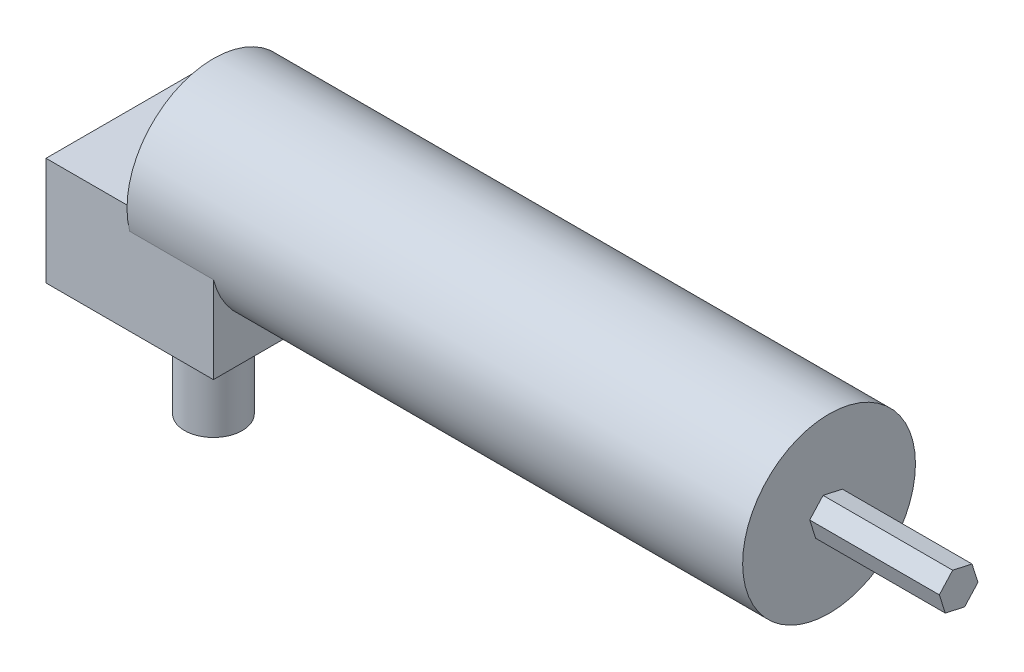
ISO-10303-21;
HEADER;
FILE_DESCRIPTION(('STEP AP214'),'2;1');
FILE_NAME('part.step','',(''),(''),'','','');
FILE_SCHEMA(('AUTOMOTIVE_DESIGN { 1 0 10303 214 1 1 1 1 }'));
ENDSEC;
DATA;
#1=APPLICATION_CONTEXT('core data for automotive mechanical design processes');
#2=APPLICATION_PROTOCOL_DEFINITION('international standard','automotive_design',2000,#1);
#3=PRODUCT_CONTEXT('',#1,'mechanical');
#4=PRODUCT('Part','Part','',(#3));
#5=PRODUCT_RELATED_PRODUCT_CATEGORY('part','',(#4));
#6=PRODUCT_DEFINITION_FORMATION('','',#4);
#7=PRODUCT_DEFINITION_CONTEXT('part definition',#1,'design');
#8=PRODUCT_DEFINITION('design','',#6,#7);
#9=PRODUCT_DEFINITION_SHAPE('','',#8);
#10=(LENGTH_UNIT() NAMED_UNIT(*) SI_UNIT(.MILLI.,.METRE.));
#11=(NAMED_UNIT(*) PLANE_ANGLE_UNIT() SI_UNIT($,.RADIAN.));
#12=(NAMED_UNIT(*) SI_UNIT($,.STERADIAN.) SOLID_ANGLE_UNIT());
#13=UNCERTAINTY_MEASURE_WITH_UNIT(LENGTH_MEASURE(1.E-05),#10,'distance_accuracy_value','');
#14=(GEOMETRIC_REPRESENTATION_CONTEXT(3) GLOBAL_UNCERTAINTY_ASSIGNED_CONTEXT((#13)) GLOBAL_UNIT_ASSIGNED_CONTEXT((#10,
#11,#12)) REPRESENTATION_CONTEXT('',''));
#15=CARTESIAN_POINT('',(0.,0.,0.));
#16=DIRECTION('',(0.,0.,1.));
#17=DIRECTION('',(1.,0.,0.));
#18=AXIS2_PLACEMENT_3D('',#15,#16,#17);
#19=CARTESIAN_POINT('',(-15.5,20.,-15.5));
#20=DIRECTION('',(0.,0.,1.));
#21=DIRECTION('',(1.,0.,0.));
#22=AXIS2_PLACEMENT_3D('',#19,#20,#21);
#23=PLANE('',#22);
#24=DIRECTION('',(-1.,0.,0.));
#25=VECTOR('',#24,1.);
#26=CARTESIAN_POINT('',(114.,16.0313730334032,-15.5));
#27=LINE('',#26,#25);
#28=CARTESIAN_POINT('',(15.5,16.0313730334032,-15.5));
#29=VERTEX_POINT('',#28);
#30=CARTESIAN_POINT('',(0.,16.0313730334032,-15.5));
#31=VERTEX_POINT('',#30);
#32=EDGE_CURVE('E281',#29,#31,#27,.T.);
#33=ORIENTED_EDGE('',*,*,#32,.F.);
#34=DIRECTION('',(0.,-1.,0.));
#35=VECTOR('',#34,1.);
#36=CARTESIAN_POINT('',(15.5,20.,-15.5));
#37=LINE('',#36,#35);
#38=CARTESIAN_POINT('',(15.5,0.,-15.5));
#39=VERTEX_POINT('',#38);
#40=EDGE_CURVE('E308',#29,#39,#37,.T.);
#41=ORIENTED_EDGE('',*,*,#40,.T.);
#42=DIRECTION('',(-1.,0.,0.));
#43=VECTOR('',#42,1.);
#44=CARTESIAN_POINT('',(-15.5,0.,-15.5));
#45=LINE('',#44,#43);
#46=CARTESIAN_POINT('',(-15.5,0.,-15.5));
#47=VERTEX_POINT('',#46);
#48=EDGE_CURVE('E295',#39,#47,#45,.T.);
#49=ORIENTED_EDGE('',*,*,#48,.T.);
#50=DIRECTION('',(0.,-1.,0.));
#51=VECTOR('',#50,1.);
#52=CARTESIAN_POINT('',(-15.5,20.,-15.5));
#53=LINE('',#52,#51);
#54=CARTESIAN_POINT('',(-15.5,20.,-15.5));
#55=VERTEX_POINT('',#54);
#56=EDGE_CURVE('E305',#55,#47,#53,.T.);
#57=ORIENTED_EDGE('',*,*,#56,.F.);
#58=DIRECTION('',(-1.,0.,0.));
#59=VECTOR('',#58,1.);
#60=CARTESIAN_POINT('',(-15.5,20.,-15.5));
#61=LINE('',#60,#59);
#62=CARTESIAN_POINT('',(0.,20.,-15.5));
#63=VERTEX_POINT('',#62);
#64=EDGE_CURVE('E285',#63,#55,#61,.T.);
#65=ORIENTED_EDGE('',*,*,#64,.F.);
#66=DIRECTION('',(0.,1.,0.));
#67=VECTOR('',#66,1.);
#68=CARTESIAN_POINT('',(0.,20.,-15.5));
#69=LINE('',#68,#67);
#70=EDGE_CURVE('E275',#31,#63,#69,.T.);
#71=ORIENTED_EDGE('',*,*,#70,.F.);
#72=EDGE_LOOP('',(#33,#41,#49,#57,#65,#71));
#73=FACE_BOUND('',#72,.T.);
#74=ADVANCED_FACE('F37',(#73),#23,.F.);
#75=CARTESIAN_POINT('',(-15.5,20.,15.5));
#76=DIRECTION('',(0.,0.,-1.));
#77=DIRECTION('',(-1.,0.,0.));
#78=AXIS2_PLACEMENT_3D('',#75,#76,#77);
#79=PLANE('',#78);
#80=DIRECTION('',(-1.,0.,0.));
#81=VECTOR('',#80,1.);
#82=CARTESIAN_POINT('',(114.,16.0313730334032,15.5));
#83=LINE('',#82,#81);
#84=CARTESIAN_POINT('',(0.,16.0313730334032,15.5));
#85=VERTEX_POINT('',#84);
#86=CARTESIAN_POINT('',(15.5,16.0313730334032,15.5));
#87=VERTEX_POINT('',#86);
#88=EDGE_CURVE('E41',#85,#87,#83,.F.);
#89=ORIENTED_EDGE('',*,*,#88,.F.);
#90=DIRECTION('',(0.,-1.,0.));
#91=VECTOR('',#90,1.);
#92=CARTESIAN_POINT('',(0.,20.,15.5));
#93=LINE('',#92,#91);
#94=CARTESIAN_POINT('',(0.,20.,15.5));
#95=VERTEX_POINT('',#94);
#96=EDGE_CURVE('E270',#95,#85,#93,.T.);
#97=ORIENTED_EDGE('',*,*,#96,.F.);
#98=DIRECTION('',(1.,0.,0.));
#99=VECTOR('',#98,1.);
#100=CARTESIAN_POINT('',(-15.5,20.,15.5));
#101=LINE('',#100,#99);
#102=CARTESIAN_POINT('',(-15.5,20.,15.5));
#103=VERTEX_POINT('',#102);
#104=EDGE_CURVE('E290',#103,#95,#101,.T.);
#105=ORIENTED_EDGE('',*,*,#104,.F.);
#106=DIRECTION('',(0.,-1.,0.));
#107=VECTOR('',#106,1.);
#108=CARTESIAN_POINT('',(-15.5,20.,15.5));
#109=LINE('',#108,#107);
#110=CARTESIAN_POINT('',(-15.5,0.,15.5));
#111=VERTEX_POINT('',#110);
#112=EDGE_CURVE('E302',#103,#111,#109,.T.);
#113=ORIENTED_EDGE('',*,*,#112,.T.);
#114=DIRECTION('',(1.,0.,0.));
#115=VECTOR('',#114,1.);
#116=CARTESIAN_POINT('',(-15.5,0.,15.5));
#117=LINE('',#116,#115);
#118=CARTESIAN_POINT('',(15.5,0.,15.5));
#119=VERTEX_POINT('',#118);
#120=EDGE_CURVE('E288',#111,#119,#117,.T.);
#121=ORIENTED_EDGE('',*,*,#120,.T.);
#122=DIRECTION('',(0.,-1.,0.));
#123=VECTOR('',#122,1.);
#124=CARTESIAN_POINT('',(15.5,20.,15.5));
#125=LINE('',#124,#123);
#126=EDGE_CURVE('E292',#87,#119,#125,.T.);
#127=ORIENTED_EDGE('',*,*,#126,.F.);
#128=EDGE_LOOP('',(#89,#97,#105,#113,#121,#127));
#129=FACE_BOUND('',#128,.T.);
#130=ADVANCED_FACE('F319',(#129),#79,.F.);
#131=CARTESIAN_POINT('',(0.,20.,0.));
#132=DIRECTION('',(0.,-1.,0.));
#133=DIRECTION('',(0.,0.,-1.));
#134=AXIS2_PLACEMENT_3D('',#131,#132,#133);
#135=PLANE('',#134);
#136=DIRECTION('',(0.,0.,1.));
#137=VECTOR('',#136,1.);
#138=CARTESIAN_POINT('',(0.,20.,0.));
#139=LINE('',#138,#137);
#140=EDGE_CURVE('E309',#63,#95,#139,.T.);
#141=ORIENTED_EDGE('',*,*,#140,.F.);
#142=ORIENTED_EDGE('',*,*,#64,.T.);
#143=DIRECTION('',(0.,0.,1.));
#144=VECTOR('',#143,1.);
#145=CARTESIAN_POINT('',(-15.5,20.,15.5));
#146=LINE('',#145,#144);
#147=EDGE_CURVE('E287',#55,#103,#146,.T.);
#148=ORIENTED_EDGE('',*,*,#147,.T.);
#149=ORIENTED_EDGE('',*,*,#104,.T.);
#150=EDGE_LOOP('',(#141,#142,#148,#149));
#151=FACE_BOUND('',#150,.T.);
#152=ADVANCED_FACE('F328',(#151),#135,.F.);
#153=CARTESIAN_POINT('',(15.5,20.,15.5));
#154=DIRECTION('',(-1.,0.,0.));
#155=DIRECTION('',(0.,0.,1.));
#156=AXIS2_PLACEMENT_3D('',#153,#154,#155);
#157=PLANE('',#156);
#158=CARTESIAN_POINT('',(15.5,20.,0.));
#159=DIRECTION('',(-1.,0.,0.));
#160=DIRECTION('',(0.,0.,1.));
#161=AXIS2_PLACEMENT_3D('',#158,#159,#160);
#162=CIRCLE('',#161,16.);
#163=EDGE_CURVE('E278',#87,#29,#162,.F.);
#164=ORIENTED_EDGE('',*,*,#163,.F.);
#165=ORIENTED_EDGE('',*,*,#126,.T.);
#166=DIRECTION('',(0.,0.,-1.));
#167=VECTOR('',#166,1.);
#168=CARTESIAN_POINT('',(15.5,0.,15.5));
#169=LINE('',#168,#167);
#170=EDGE_CURVE('E284',#119,#39,#169,.T.);
#171=ORIENTED_EDGE('',*,*,#170,.T.);
#172=ORIENTED_EDGE('',*,*,#40,.F.);
#173=EDGE_LOOP('',(#164,#165,#171,#172));
#174=FACE_BOUND('',#173,.T.);
#175=ADVANCED_FACE('F39',(#174),#157,.F.);
#176=CARTESIAN_POINT('',(-15.5,20.,15.5));
#177=DIRECTION('',(1.,0.,0.));
#178=DIRECTION('',(0.,0.,-1.));
#179=AXIS2_PLACEMENT_3D('',#176,#177,#178);
#180=PLANE('',#179);
#181=DIRECTION('',(0.,0.,1.));
#182=VECTOR('',#181,1.);
#183=CARTESIAN_POINT('',(-15.5,0.,15.5));
#184=LINE('',#183,#182);
#185=EDGE_CURVE('E297',#47,#111,#184,.T.);
#186=ORIENTED_EDGE('',*,*,#185,.T.);
#187=ORIENTED_EDGE('',*,*,#112,.F.);
#188=ORIENTED_EDGE('',*,*,#147,.F.);
#189=ORIENTED_EDGE('',*,*,#56,.T.);
#190=EDGE_LOOP('',(#186,#187,#188,#189));
#191=FACE_BOUND('',#190,.T.);
#192=ADVANCED_FACE('F338',(#191),#180,.F.);
#193=CARTESIAN_POINT('',(0.,0.,0.));
#194=DIRECTION('',(0.,-1.,0.));
#195=DIRECTION('',(0.,0.,-1.));
#196=AXIS2_PLACEMENT_3D('',#193,#194,#195);
#197=PLANE('',#196);
#198=CARTESIAN_POINT('',(0.,0.,0.));
#199=DIRECTION('',(0.,-1.,0.));
#200=DIRECTION('',(0.,0.,-1.));
#201=AXIS2_PLACEMENT_3D('',#198,#199,#200);
#202=CIRCLE('',#201,5.35);
#203=CARTESIAN_POINT('',(0.,0.,5.35));
#204=VERTEX_POINT('',#203);
#205=EDGE_CURVE('E11',#204,#204,#202,.T.);
#206=ORIENTED_EDGE('',*,*,#205,.F.);
#207=EDGE_LOOP('',(#206));
#208=FACE_BOUND('',#207,.T.);
#209=ORIENTED_EDGE('',*,*,#170,.F.);
#210=ORIENTED_EDGE('',*,*,#120,.F.);
#211=ORIENTED_EDGE('',*,*,#185,.F.);
#212=ORIENTED_EDGE('',*,*,#48,.F.);
#213=EDGE_LOOP('',(#209,#210,#211,#212));
#214=FACE_BOUND('',#213,.T.);
#215=ADVANCED_FACE('F335',(#208,#214),#197,.T.);
#216=CARTESIAN_POINT('',(114.,20.,0.));
#217=DIRECTION('',(-1.,0.,0.));
#218=DIRECTION('',(0.,0.,1.));
#219=AXIS2_PLACEMENT_3D('',#216,#217,#218);
#220=CYLINDRICAL_SURFACE('',#219,16.);
#221=CARTESIAN_POINT('',(114.,20.,0.));
#222=DIRECTION('',(1.,0.,0.));
#223=DIRECTION('',(0.,0.,-1.));
#224=AXIS2_PLACEMENT_3D('',#221,#222,#223);
#225=CIRCLE('',#224,16.);
#226=CARTESIAN_POINT('',(114.,20.,-16.));
#227=VERTEX_POINT('',#226);
#228=EDGE_CURVE('E267',#227,#227,#225,.T.);
#229=ORIENTED_EDGE('',*,*,#228,.F.);
#230=EDGE_LOOP('',(#229));
#231=FACE_BOUND('',#230,.T.);
#232=ORIENTED_EDGE('',*,*,#163,.T.);
#233=ORIENTED_EDGE('',*,*,#32,.T.);
#234=CARTESIAN_POINT('',(0.,20.,0.));
#235=DIRECTION('',(1.,0.,0.));
#236=DIRECTION('',(0.,0.,-1.));
#237=AXIS2_PLACEMENT_3D('',#234,#235,#236);
#238=CIRCLE('',#237,16.);
#239=EDGE_CURVE('E266',#31,#85,#238,.T.);
#240=ORIENTED_EDGE('',*,*,#239,.T.);
#241=ORIENTED_EDGE('',*,*,#88,.T.);
#242=EDGE_LOOP('',(#232,#233,#240,#241));
#243=FACE_BOUND('',#242,.T.);
#244=ADVANCED_FACE('F314',(#231,#243),#220,.T.);
#245=CARTESIAN_POINT('',(0.,20.,0.));
#246=DIRECTION('',(1.,0.,0.));
#247=DIRECTION('',(0.,0.,-1.));
#248=AXIS2_PLACEMENT_3D('',#245,#246,#247);
#249=PLANE('',#248);
#250=ORIENTED_EDGE('',*,*,#239,.F.);
#251=ORIENTED_EDGE('',*,*,#70,.T.);
#252=ORIENTED_EDGE('',*,*,#140,.T.);
#253=ORIENTED_EDGE('',*,*,#96,.T.);
#254=EDGE_LOOP('',(#250,#251,#252,#253));
#255=FACE_BOUND('',#254,.T.);
#256=ADVANCED_FACE('F321',(#255),#249,.F.);
#257=CARTESIAN_POINT('',(114.,20.,0.));
#258=DIRECTION('',(1.,0.,0.));
#259=DIRECTION('',(0.,0.,-1.));
#260=AXIS2_PLACEMENT_3D('',#257,#258,#259);
#261=PLANE('',#260);
#262=DIRECTION('',(0.,0.952930126310107,0.303189997147998));
#263=VECTOR('',#262,1.);
#264=CARTESIAN_POINT('',(114.,19.2158243147475,-3.58132682507366));
#265=LINE('',#264,#263);
#266=CARTESIAN_POINT('',(114.,19.2158243147475,-3.58132682507366));
#267=VERTEX_POINT('',#266);
#268=CARTESIAN_POINT('',(114.,22.7094321671422,-2.46977947699552));
#269=VERTEX_POINT('',#268);
#270=EDGE_CURVE('E61',#267,#269,#265,.T.);
#271=ORIENTED_EDGE('',*,*,#270,.F.);
#272=DIRECTION('',(0.,0.739035302858551,-0.673666698842068));
#273=VECTOR('',#272,1.);
#274=CARTESIAN_POINT('',(114.,16.5063921476053,-1.11154734807815));
#275=LINE('',#274,#273);
#276=CARTESIAN_POINT('',(114.,16.5063921476053,-1.11154734807815));
#277=VERTEX_POINT('',#276);
#278=EDGE_CURVE('E224',#277,#267,#275,.T.);
#279=ORIENTED_EDGE('',*,*,#278,.F.);
#280=DIRECTION('',(0.,-0.213894823451555,-0.976856695990066));
#281=VECTOR('',#280,1.);
#282=CARTESIAN_POINT('',(114.,17.2905678328578,2.46977947699552));
#283=LINE('',#282,#281);
#284=CARTESIAN_POINT('',(114.,17.2905678328578,2.46977947699552));
#285=VERTEX_POINT('',#284);
#286=EDGE_CURVE('E245',#285,#277,#283,.T.);
#287=ORIENTED_EDGE('',*,*,#286,.F.);
#288=DIRECTION('',(0.,-0.952930126310107,-0.303189997147999));
#289=VECTOR('',#288,1.);
#290=CARTESIAN_POINT('',(114.,20.7841756852524,3.58132682507366));
#291=LINE('',#290,#289);
#292=CARTESIAN_POINT('',(114.,20.7841756852524,3.58132682507366));
#293=VERTEX_POINT('',#292);
#294=EDGE_CURVE('E242',#293,#285,#291,.T.);
#295=ORIENTED_EDGE('',*,*,#294,.F.);
#296=DIRECTION('',(0.,-0.739035302858551,0.673666698842068));
#297=VECTOR('',#296,1.);
#298=CARTESIAN_POINT('',(114.,23.4936078523947,1.11154734807814));
#299=LINE('',#298,#297);
#300=CARTESIAN_POINT('',(114.,23.4936078523947,1.11154734807814));
#301=VERTEX_POINT('',#300);
#302=EDGE_CURVE('E239',#301,#293,#299,.T.);
#303=ORIENTED_EDGE('',*,*,#302,.F.);
#304=DIRECTION('',(0.,0.213894823451555,0.976856695990066));
#305=VECTOR('',#304,1.);
#306=CARTESIAN_POINT('',(114.,22.7094321671422,-2.46977947699552));
#307=LINE('',#306,#305);
#308=EDGE_CURVE('E236',#269,#301,#307,.T.);
#309=ORIENTED_EDGE('',*,*,#308,.F.);
#310=EDGE_LOOP('',(#271,#279,#287,#295,#303,#309));
#311=FACE_BOUND('',#310,.T.);
#312=ORIENTED_EDGE('',*,*,#228,.T.);
#313=EDGE_LOOP('',(#312));
#314=FACE_BOUND('',#313,.T.);
#315=ADVANCED_FACE('F362',(#311,#314),#261,.T.);
#316=CARTESIAN_POINT('',(138.,19.2158243147475,-3.58132682507366));
#317=DIRECTION('',(0.,-0.303189997147998,0.952930126310107));
#318=DIRECTION('',(0.,-0.952930126310107,-0.303189997147998));
#319=AXIS2_PLACEMENT_3D('',#316,#317,#318);
#320=PLANE('',#319);
#321=ORIENTED_EDGE('',*,*,#270,.T.);
#322=DIRECTION('',(-1.,0.,0.));
#323=VECTOR('',#322,1.);
#324=CARTESIAN_POINT('',(138.,22.7094321671422,-2.46977947699552));
#325=LINE('',#324,#323);
#326=CARTESIAN_POINT('',(138.,22.7094321671422,-2.46977947699552));
#327=VERTEX_POINT('',#326);
#328=EDGE_CURVE('E263',#327,#269,#325,.T.);
#329=ORIENTED_EDGE('',*,*,#328,.F.);
#330=DIRECTION('',(0.,0.952930126310107,0.303189997147998));
#331=VECTOR('',#330,1.);
#332=CARTESIAN_POINT('',(138.,19.2158243147475,-3.58132682507366));
#333=LINE('',#332,#331);
#334=CARTESIAN_POINT('',(138.,19.2158243147475,-3.58132682507366));
#335=VERTEX_POINT('',#334);
#336=EDGE_CURVE('E220',#335,#327,#333,.T.);
#337=ORIENTED_EDGE('',*,*,#336,.F.);
#338=DIRECTION('',(-1.,0.,0.));
#339=VECTOR('',#338,1.);
#340=CARTESIAN_POINT('',(138.,19.2158243147475,-3.58132682507366));
#341=LINE('',#340,#339);
#342=EDGE_CURVE('E234',#335,#267,#341,.T.);
#343=ORIENTED_EDGE('',*,*,#342,.T.);
#344=EDGE_LOOP('',(#321,#329,#337,#343));
#345=FACE_BOUND('',#344,.T.);
#346=ADVANCED_FACE('F365',(#345),#320,.F.);
#347=CARTESIAN_POINT('',(138.,22.7094321671422,-2.46977947699552));
#348=DIRECTION('',(0.,-0.976856695990066,0.213894823451555));
#349=DIRECTION('',(0.,-0.213894823451555,-0.976856695990066));
#350=AXIS2_PLACEMENT_3D('',#347,#348,#349);
#351=PLANE('',#350);
#352=ORIENTED_EDGE('',*,*,#308,.T.);
#353=DIRECTION('',(-1.,0.,0.));
#354=VECTOR('',#353,1.);
#355=CARTESIAN_POINT('',(138.,23.4936078523947,1.11154734807814));
#356=LINE('',#355,#354);
#357=CARTESIAN_POINT('',(138.,23.4936078523947,1.11154734807814));
#358=VERTEX_POINT('',#357);
#359=EDGE_CURVE('E260',#358,#301,#356,.T.);
#360=ORIENTED_EDGE('',*,*,#359,.F.);
#361=DIRECTION('',(0.,0.213894823451555,0.976856695990066));
#362=VECTOR('',#361,1.);
#363=CARTESIAN_POINT('',(138.,22.7094321671422,-2.46977947699552));
#364=LINE('',#363,#362);
#365=EDGE_CURVE('E223',#327,#358,#364,.T.);
#366=ORIENTED_EDGE('',*,*,#365,.F.);
#367=ORIENTED_EDGE('',*,*,#328,.T.);
#368=EDGE_LOOP('',(#352,#360,#366,#367));
#369=FACE_BOUND('',#368,.T.);
#370=ADVANCED_FACE('F368',(#369),#351,.F.);
#371=CARTESIAN_POINT('',(138.,23.4936078523947,1.11154734807814));
#372=DIRECTION('',(0.,-0.673666698842068,-0.739035302858551));
#373=DIRECTION('',(0.,0.739035302858551,-0.673666698842068));
#374=AXIS2_PLACEMENT_3D('',#371,#372,#373);
#375=PLANE('',#374);
#376=ORIENTED_EDGE('',*,*,#302,.T.);
#377=DIRECTION('',(-1.,0.,0.));
#378=VECTOR('',#377,1.);
#379=CARTESIAN_POINT('',(138.,20.7841756852524,3.58132682507366));
#380=LINE('',#379,#378);
#381=CARTESIAN_POINT('',(138.,20.7841756852524,3.58132682507366));
#382=VERTEX_POINT('',#381);
#383=EDGE_CURVE('E257',#382,#293,#380,.T.);
#384=ORIENTED_EDGE('',*,*,#383,.F.);
#385=DIRECTION('',(0.,-0.739035302858551,0.673666698842068));
#386=VECTOR('',#385,1.);
#387=CARTESIAN_POINT('',(138.,23.4936078523947,1.11154734807814));
#388=LINE('',#387,#386);
#389=EDGE_CURVE('E226',#358,#382,#388,.T.);
#390=ORIENTED_EDGE('',*,*,#389,.F.);
#391=ORIENTED_EDGE('',*,*,#359,.T.);
#392=EDGE_LOOP('',(#376,#384,#390,#391));
#393=FACE_BOUND('',#392,.T.);
#394=ADVANCED_FACE('F372',(#393),#375,.F.);
#395=CARTESIAN_POINT('',(138.,20.7841756852524,3.58132682507366));
#396=DIRECTION('',(0.,0.303189997147999,-0.952930126310107));
#397=DIRECTION('',(0.,0.952930126310107,0.303189997147999));
#398=AXIS2_PLACEMENT_3D('',#395,#396,#397);
#399=PLANE('',#398);
#400=ORIENTED_EDGE('',*,*,#294,.T.);
#401=DIRECTION('',(-1.,0.,0.));
#402=VECTOR('',#401,1.);
#403=CARTESIAN_POINT('',(138.,17.2905678328578,2.46977947699552));
#404=LINE('',#403,#402);
#405=CARTESIAN_POINT('',(138.,17.2905678328578,2.46977947699552));
#406=VERTEX_POINT('',#405);
#407=EDGE_CURVE('E254',#406,#285,#404,.T.);
#408=ORIENTED_EDGE('',*,*,#407,.F.);
#409=DIRECTION('',(0.,-0.952930126310107,-0.303189997147999));
#410=VECTOR('',#409,1.);
#411=CARTESIAN_POINT('',(138.,20.7841756852524,3.58132682507366));
#412=LINE('',#411,#410);
#413=EDGE_CURVE('E228',#382,#406,#412,.T.);
#414=ORIENTED_EDGE('',*,*,#413,.F.);
#415=ORIENTED_EDGE('',*,*,#383,.T.);
#416=EDGE_LOOP('',(#400,#408,#414,#415));
#417=FACE_BOUND('',#416,.T.);
#418=ADVANCED_FACE('F376',(#417),#399,.F.);
#419=CARTESIAN_POINT('',(138.,17.2905678328578,2.46977947699552));
#420=DIRECTION('',(0.,0.976856695990066,-0.213894823451555));
#421=DIRECTION('',(0.,0.213894823451555,0.976856695990066));
#422=AXIS2_PLACEMENT_3D('',#419,#420,#421);
#423=PLANE('',#422);
#424=ORIENTED_EDGE('',*,*,#286,.T.);
#425=DIRECTION('',(-1.,0.,0.));
#426=VECTOR('',#425,1.);
#427=CARTESIAN_POINT('',(138.,16.5063921476053,-1.11154734807815));
#428=LINE('',#427,#426);
#429=CARTESIAN_POINT('',(138.,16.5063921476053,-1.11154734807815));
#430=VERTEX_POINT('',#429);
#431=EDGE_CURVE('E251',#430,#277,#428,.T.);
#432=ORIENTED_EDGE('',*,*,#431,.F.);
#433=DIRECTION('',(0.,-0.213894823451555,-0.976856695990066));
#434=VECTOR('',#433,1.);
#435=CARTESIAN_POINT('',(138.,17.2905678328578,2.46977947699552));
#436=LINE('',#435,#434);
#437=EDGE_CURVE('E230',#406,#430,#436,.T.);
#438=ORIENTED_EDGE('',*,*,#437,.F.);
#439=ORIENTED_EDGE('',*,*,#407,.T.);
#440=EDGE_LOOP('',(#424,#432,#438,#439));
#441=FACE_BOUND('',#440,.T.);
#442=ADVANCED_FACE('F380',(#441),#423,.F.);
#443=CARTESIAN_POINT('',(138.,16.5063921476053,-1.11154734807815));
#444=DIRECTION('',(0.,0.673666698842068,0.739035302858551));
#445=DIRECTION('',(0.,-0.739035302858551,0.673666698842068));
#446=AXIS2_PLACEMENT_3D('',#443,#444,#445);
#447=PLANE('',#446);
#448=ORIENTED_EDGE('',*,*,#278,.T.);
#449=ORIENTED_EDGE('',*,*,#342,.F.);
#450=DIRECTION('',(0.,0.739035302858551,-0.673666698842068));
#451=VECTOR('',#450,1.);
#452=CARTESIAN_POINT('',(138.,16.5063921476053,-1.11154734807815));
#453=LINE('',#452,#451);
#454=EDGE_CURVE('E232',#430,#335,#453,.T.);
#455=ORIENTED_EDGE('',*,*,#454,.F.);
#456=ORIENTED_EDGE('',*,*,#431,.T.);
#457=EDGE_LOOP('',(#448,#449,#455,#456));
#458=FACE_BOUND('',#457,.T.);
#459=ADVANCED_FACE('F384',(#458),#447,.F.);
#460=CARTESIAN_POINT('',(138.,0.,0.));
#461=DIRECTION('',(1.,0.,0.));
#462=DIRECTION('',(0.,0.,-1.));
#463=AXIS2_PLACEMENT_3D('',#460,#461,#462);
#464=PLANE('',#463);
#465=ORIENTED_EDGE('',*,*,#336,.T.);
#466=ORIENTED_EDGE('',*,*,#365,.T.);
#467=ORIENTED_EDGE('',*,*,#389,.T.);
#468=ORIENTED_EDGE('',*,*,#413,.T.);
#469=ORIENTED_EDGE('',*,*,#437,.T.);
#470=ORIENTED_EDGE('',*,*,#454,.T.);
#471=EDGE_LOOP('',(#465,#466,#467,#468,#469,#470));
#472=FACE_BOUND('',#471,.T.);
#473=ADVANCED_FACE('F388',(#472),#464,.T.);
#474=CARTESIAN_POINT('',(0.,-21.,0.));
#475=DIRECTION('',(0.,1.,0.));
#476=DIRECTION('',(0.,0.,1.));
#477=AXIS2_PLACEMENT_3D('',#474,#475,#476);
#478=CYLINDRICAL_SURFACE('',#477,5.35);
#479=CARTESIAN_POINT('',(0.,-21.,0.));
#480=DIRECTION('',(0.,-1.,0.));
#481=DIRECTION('',(0.,0.,-1.));
#482=AXIS2_PLACEMENT_3D('',#479,#480,#481);
#483=CIRCLE('',#482,5.35);
#484=CARTESIAN_POINT('',(0.,-21.,5.35));
#485=VERTEX_POINT('',#484);
#486=EDGE_CURVE('E210',#485,#485,#483,.T.);
#487=CARTESIAN_POINT('',(0.,-21.,5.35));
#488=CARTESIAN_POINT('',(0.,-20.78125,5.35));
#489=CARTESIAN_POINT('',(0.,-20.5625,5.35));
#490=CARTESIAN_POINT('',(0.,-20.125,5.35));
#491=CARTESIAN_POINT('',(0.,-19.90625,5.35));
#492=CARTESIAN_POINT('',(0.,-19.46875,5.35));
#493=CARTESIAN_POINT('',(0.,-19.25,5.35));
#494=CARTESIAN_POINT('',(0.,-18.8125,5.35));
#495=CARTESIAN_POINT('',(0.,-18.59375,5.35));
#496=CARTESIAN_POINT('',(0.,-18.15625,5.35));
#497=CARTESIAN_POINT('',(0.,-17.9375,5.35));
#498=CARTESIAN_POINT('',(0.,-17.5,5.35));
#499=CARTESIAN_POINT('',(0.,-17.28125,5.35));
#500=CARTESIAN_POINT('',(0.,-16.84375,5.35));
#501=CARTESIAN_POINT('',(0.,-16.625,5.35));
#502=CARTESIAN_POINT('',(0.,-16.1875,5.35));
#503=CARTESIAN_POINT('',(0.,-15.96875,5.35));
#504=CARTESIAN_POINT('',(0.,-15.53125,5.35));
#505=CARTESIAN_POINT('',(0.,-15.3125,5.35));
#506=CARTESIAN_POINT('',(0.,-14.875,5.35));
#507=CARTESIAN_POINT('',(0.,-14.65625,5.35));
#508=CARTESIAN_POINT('',(0.,-14.21875,5.35));
#509=CARTESIAN_POINT('',(0.,-14.,5.35));
#510=CARTESIAN_POINT('',(0.,-13.5625,5.35));
#511=CARTESIAN_POINT('',(0.,-13.34375,5.35));
#512=CARTESIAN_POINT('',(0.,-12.90625,5.35));
#513=CARTESIAN_POINT('',(0.,-12.6875,5.35));
#514=CARTESIAN_POINT('',(0.,-12.25,5.35));
#515=CARTESIAN_POINT('',(0.,-12.03125,5.35));
#516=CARTESIAN_POINT('',(0.,-11.59375,5.35));
#517=CARTESIAN_POINT('',(0.,-11.375,5.35));
#518=CARTESIAN_POINT('',(0.,-10.9375,5.35));
#519=CARTESIAN_POINT('',(0.,-10.71875,5.35));
#520=CARTESIAN_POINT('',(0.,-10.28125,5.35));
#521=CARTESIAN_POINT('',(0.,-10.0625,5.35));
#522=CARTESIAN_POINT('',(0.,-9.625,5.35));
#523=CARTESIAN_POINT('',(0.,-9.40625,5.35));
#524=CARTESIAN_POINT('',(0.,-8.96875,5.35));
#525=CARTESIAN_POINT('',(0.,-8.75,5.35));
#526=CARTESIAN_POINT('',(0.,-8.3125,5.35));
#527=CARTESIAN_POINT('',(0.,-8.09375,5.35));
#528=CARTESIAN_POINT('',(0.,-7.65625,5.35));
#529=CARTESIAN_POINT('',(0.,-7.4375,5.35));
#530=CARTESIAN_POINT('',(0.,-7.,5.35));
#531=CARTESIAN_POINT('',(0.,-6.78125,5.35));
#532=CARTESIAN_POINT('',(0.,-6.34375,5.35));
#533=CARTESIAN_POINT('',(0.,-6.125,5.35));
#534=CARTESIAN_POINT('',(0.,-5.6875,5.35));
#535=CARTESIAN_POINT('',(0.,-5.46875,5.35));
#536=CARTESIAN_POINT('',(0.,-5.03125,5.35));
#537=CARTESIAN_POINT('',(0.,-4.8125,5.35));
#538=CARTESIAN_POINT('',(0.,-4.375,5.35));
#539=CARTESIAN_POINT('',(0.,-4.15625,5.35));
#540=CARTESIAN_POINT('',(0.,-3.71875,5.35));
#541=CARTESIAN_POINT('',(0.,-3.5,5.35));
#542=CARTESIAN_POINT('',(0.,-3.0625,5.35));
#543=CARTESIAN_POINT('',(0.,-2.84375,5.35));
#544=CARTESIAN_POINT('',(0.,-2.40625,5.35));
#545=CARTESIAN_POINT('',(0.,-2.1875,5.35));
#546=CARTESIAN_POINT('',(0.,-1.75,5.35));
#547=CARTESIAN_POINT('',(0.,-1.53125,5.35));
#548=CARTESIAN_POINT('',(0.,-1.09375,5.35));
#549=CARTESIAN_POINT('',(0.,-0.875000000000001,5.35));
#550=CARTESIAN_POINT('',(0.,-0.4375,5.35));
#551=CARTESIAN_POINT('',(0.,-0.21875,5.35));
#552=CARTESIAN_POINT('',(0.,0.,5.35));
#553=B_SPLINE_CURVE_WITH_KNOTS('',3,(#487,#488,#489,#490,#491,#492,#493,#494,#495,#496,#497,
#498,#499,#500,#501,#502,#503,#504,#505,#506,#507,#508,#509,#510,#511,#512,#513,#514,#515,#516,
#517,#518,#519,#520,#521,#522,#523,#524,#525,#526,#527,#528,#529,#530,#531,#532,#533,#534,#535,
#536,#537,#538,#539,#540,#541,#542,#543,#544,#545,#546,#547,#548,#549,#550,#551,#552),
.UNSPECIFIED.,.F.,.F.,(4,2,2,2,2,2,2,2,2,2,2,2,2,2,2,2,2,2,2,2,2,2,2,2,2,2,2,2,2,2,2,2,4),(0.,
0.656250000000001,1.3125,1.96875,2.625,3.28125,3.9375,4.59375,5.25,5.90625,6.5625,7.21875,7.875,
8.53125,9.1875,9.84375,10.5,11.15625,11.8125,12.46875,13.125,13.78125,14.4375,15.09375,15.75,
16.40625,17.0625,17.71875,18.375,19.03125,19.6875,20.34375,21.),.UNSPECIFIED.);
#554=EDGE_CURVE('BSEAM392',#485,#204,#553,.T.);
#555=ORIENTED_EDGE('',*,*,#486,.F.);
#556=ORIENTED_EDGE('',*,*,#205,.T.);
#557=ORIENTED_EDGE('',*,*,#554,.T.);
#558=ORIENTED_EDGE('',*,*,#554,.F.);
#559=EDGE_LOOP('',(#555,#557,#556,#558));
#560=FACE_BOUND('',#559,.T.);
#561=ADVANCED_FACE('F392',(#560),#478,.T.);
#562=CARTESIAN_POINT('',(0.,-21.,0.));
#563=DIRECTION('',(0.,-1.,0.));
#564=DIRECTION('',(0.,0.,-1.));
#565=AXIS2_PLACEMENT_3D('',#562,#563,#564);
#566=PLANE('',#565);
#567=DIRECTION('',(-0.303802552575767,0.,-0.952735015126687));
#568=VECTOR('',#567,1.);
#569=CARTESIAN_POINT('',(-2.720670853658,-21.,2.9885252950894));
#570=LINE('',#569,#568);
#571=CARTESIAN_POINT('',(-2.720670853658,-21.,2.9885252950894));
#572=VERTEX_POINT('',#571);
#573=CARTESIAN_POINT('',(-3.94847425222881,-21.,-0.861907427059027));
#574=VERTEX_POINT('',#573);
#575=EDGE_CURVE('E53',#572,#574,#570,.T.);
#576=ORIENTED_EDGE('',*,*,#575,.F.);
#577=DIRECTION('',(-0.976994002462546,0.,-0.213266779298172));
#578=VECTOR('',#577,1.);
#579=CARTESIAN_POINT('',(1.2278033985708,-21.,3.85043272214842));
#580=LINE('',#579,#578);
#581=CARTESIAN_POINT('',(1.2278033985708,-21.,3.85043272214842));
#582=VERTEX_POINT('',#581);
#583=EDGE_CURVE('E184',#582,#572,#580,.T.);
#584=ORIENTED_EDGE('',*,*,#583,.F.);
#585=DIRECTION('',(-0.673191449886779,0.,0.739468235828515));
#586=VECTOR('',#585,1.);
#587=CARTESIAN_POINT('',(3.9484742522288,-21.,0.861907427059029));
#588=LINE('',#587,#586);
#589=CARTESIAN_POINT('',(3.9484742522288,-21.,0.861907427059029));
#590=VERTEX_POINT('',#589);
#591=EDGE_CURVE('E187',#590,#582,#588,.T.);
#592=ORIENTED_EDGE('',*,*,#591,.F.);
#593=DIRECTION('',(0.303802552575767,0.,0.952735015126687));
#594=VECTOR('',#593,1.);
#595=CARTESIAN_POINT('',(2.720670853658,-21.,-2.98852529508939));
#596=LINE('',#595,#594);
#597=CARTESIAN_POINT('',(2.720670853658,-21.,-2.98852529508939));
#598=VERTEX_POINT('',#597);
#599=EDGE_CURVE('E203',#598,#590,#596,.T.);
#600=ORIENTED_EDGE('',*,*,#599,.F.);
#601=DIRECTION('',(0.976994002462546,0.,0.213266779298172));
#602=VECTOR('',#601,1.);
#603=CARTESIAN_POINT('',(-1.2278033985708,-21.,-3.85043272214842));
#604=LINE('',#603,#602);
#605=CARTESIAN_POINT('',(-1.2278033985708,-21.,-3.85043272214842));
#606=VERTEX_POINT('',#605);
#607=EDGE_CURVE('E200',#606,#598,#604,.T.);
#608=ORIENTED_EDGE('',*,*,#607,.F.);
#609=DIRECTION('',(0.673191449886779,0.,-0.739468235828515));
#610=VECTOR('',#609,1.);
#611=CARTESIAN_POINT('',(-3.9484742522288,-21.,-0.861907427059027));
#612=LINE('',#611,#610);
#613=EDGE_CURVE('E198',#574,#606,#612,.T.);
#614=ORIENTED_EDGE('',*,*,#613,.F.);
#615=EDGE_LOOP('',(#576,#584,#592,#600,#608,#614));
#616=FACE_BOUND('',#615,.T.);
#617=ORIENTED_EDGE('',*,*,#486,.T.);
#618=EDGE_LOOP('',(#617));
#619=FACE_BOUND('',#618,.T.);
#620=ADVANCED_FACE('F396',(#616,#619),#566,.T.);
#621=CARTESIAN_POINT('',(-2.720670853658,-13.59,2.9885252950894));
#622=DIRECTION('',(-0.952735015126687,0.,0.303802552575767));
#623=DIRECTION('',(0.303802552575767,0.,0.952735015126687));
#624=AXIS2_PLACEMENT_3D('',#621,#622,#623);
#625=PLANE('',#624);
#626=ORIENTED_EDGE('',*,*,#575,.T.);
#627=DIRECTION('',(0.,-1.,0.));
#628=VECTOR('',#627,1.);
#629=CARTESIAN_POINT('',(-3.9484742522288,-13.59,-0.861907427059027));
#630=LINE('',#629,#628);
#631=CARTESIAN_POINT('',(-3.9484742522288,-13.59,-0.861907427059027));
#632=VERTEX_POINT('',#631);
#633=EDGE_CURVE('E161',#632,#574,#630,.T.);
#634=ORIENTED_EDGE('',*,*,#633,.F.);
#635=DIRECTION('',(-0.303802552575767,0.,-0.952735015126687));
#636=VECTOR('',#635,1.);
#637=CARTESIAN_POINT('',(-2.720670853658,-13.59,2.9885252950894));
#638=LINE('',#637,#636);
#639=CARTESIAN_POINT('',(-2.720670853658,-13.59,2.9885252950894));
#640=VERTEX_POINT('',#639);
#641=EDGE_CURVE('E165',#640,#632,#638,.T.);
#642=ORIENTED_EDGE('',*,*,#641,.F.);
#643=DIRECTION('',(0.,-1.,0.));
#644=VECTOR('',#643,1.);
#645=CARTESIAN_POINT('',(-2.720670853658,-13.59,2.9885252950894));
#646=LINE('',#645,#644);
#647=EDGE_CURVE('E208',#640,#572,#646,.T.);
#648=ORIENTED_EDGE('',*,*,#647,.T.);
#649=EDGE_LOOP('',(#626,#634,#642,#648));
#650=FACE_BOUND('',#649,.T.);
#651=ADVANCED_FACE('F163',(#650),#625,.F.);
#652=CARTESIAN_POINT('',(1.2278033985708,-13.59,3.85043272214842));
#653=DIRECTION('',(-0.213266779298172,0.,0.976994002462546));
#654=DIRECTION('',(0.976994002462546,0.,0.213266779298172));
#655=AXIS2_PLACEMENT_3D('',#652,#653,#654);
#656=PLANE('',#655);
#657=ORIENTED_EDGE('',*,*,#583,.T.);
#658=ORIENTED_EDGE('',*,*,#647,.F.);
#659=DIRECTION('',(-0.976994002462546,0.,-0.213266779298172));
#660=VECTOR('',#659,1.);
#661=CARTESIAN_POINT('',(1.2278033985708,-13.59,3.85043272214842));
#662=LINE('',#661,#660);
#663=CARTESIAN_POINT('',(1.2278033985708,-13.59,3.85043272214842));
#664=VERTEX_POINT('',#663);
#665=EDGE_CURVE('E171',#664,#640,#662,.T.);
#666=ORIENTED_EDGE('',*,*,#665,.F.);
#667=DIRECTION('',(0.,-1.,0.));
#668=VECTOR('',#667,1.);
#669=CARTESIAN_POINT('',(1.2278033985708,-13.59,3.85043272214842));
#670=LINE('',#669,#668);
#671=EDGE_CURVE('E211',#664,#582,#670,.T.);
#672=ORIENTED_EDGE('',*,*,#671,.T.);
#673=EDGE_LOOP('',(#657,#658,#666,#672));
#674=FACE_BOUND('',#673,.T.);
#675=ADVANCED_FACE('F403',(#674),#656,.F.);
#676=CARTESIAN_POINT('',(3.9484742522288,-13.59,0.861907427059029));
#677=DIRECTION('',(0.739468235828515,0.,0.673191449886779));
#678=DIRECTION('',(0.673191449886779,0.,-0.739468235828515));
#679=AXIS2_PLACEMENT_3D('',#676,#677,#678);
#680=PLANE('',#679);
#681=ORIENTED_EDGE('',*,*,#591,.T.);
#682=ORIENTED_EDGE('',*,*,#671,.F.);
#683=DIRECTION('',(-0.673191449886779,0.,0.739468235828515));
#684=VECTOR('',#683,1.);
#685=CARTESIAN_POINT('',(3.9484742522288,-13.59,0.861907427059029));
#686=LINE('',#685,#684);
#687=CARTESIAN_POINT('',(3.9484742522288,-13.59,0.861907427059029));
#688=VERTEX_POINT('',#687);
#689=EDGE_CURVE('E194',#688,#664,#686,.T.);
#690=ORIENTED_EDGE('',*,*,#689,.F.);
#691=DIRECTION('',(0.,-1.,0.));
#692=VECTOR('',#691,1.);
#693=CARTESIAN_POINT('',(3.9484742522288,-13.59,0.861907427059029));
#694=LINE('',#693,#692);
#695=EDGE_CURVE('E213',#688,#590,#694,.T.);
#696=ORIENTED_EDGE('',*,*,#695,.T.);
#697=EDGE_LOOP('',(#681,#682,#690,#696));
#698=FACE_BOUND('',#697,.T.);
#699=ADVANCED_FACE('F413',(#698),#680,.F.);
#700=CARTESIAN_POINT('',(2.720670853658,-13.59,-2.98852529508939));
#701=DIRECTION('',(0.952735015126687,0.,-0.303802552575767));
#702=DIRECTION('',(-0.303802552575767,0.,-0.952735015126687));
#703=AXIS2_PLACEMENT_3D('',#700,#701,#702);
#704=PLANE('',#703);
#705=ORIENTED_EDGE('',*,*,#599,.T.);
#706=ORIENTED_EDGE('',*,*,#695,.F.);
#707=DIRECTION('',(0.303802552575767,0.,0.952735015126687));
#708=VECTOR('',#707,1.);
#709=CARTESIAN_POINT('',(2.720670853658,-13.59,-2.98852529508939));
#710=LINE('',#709,#708);
#711=CARTESIAN_POINT('',(2.720670853658,-13.59,-2.98852529508939));
#712=VERTEX_POINT('',#711);
#713=EDGE_CURVE('E191',#712,#688,#710,.T.);
#714=ORIENTED_EDGE('',*,*,#713,.F.);
#715=DIRECTION('',(0.,-1.,0.));
#716=VECTOR('',#715,1.);
#717=CARTESIAN_POINT('',(2.720670853658,-13.59,-2.98852529508939));
#718=LINE('',#717,#716);
#719=EDGE_CURVE('E215',#712,#598,#718,.T.);
#720=ORIENTED_EDGE('',*,*,#719,.T.);
#721=EDGE_LOOP('',(#705,#706,#714,#720));
#722=FACE_BOUND('',#721,.T.);
#723=ADVANCED_FACE('F409',(#722),#704,.F.);
#724=CARTESIAN_POINT('',(-1.2278033985708,-13.59,-3.85043272214842));
#725=DIRECTION('',(0.213266779298172,0.,-0.976994002462546));
#726=DIRECTION('',(-0.976994002462546,0.,-0.213266779298172));
#727=AXIS2_PLACEMENT_3D('',#724,#725,#726);
#728=PLANE('',#727);
#729=ORIENTED_EDGE('',*,*,#607,.T.);
#730=ORIENTED_EDGE('',*,*,#719,.F.);
#731=DIRECTION('',(0.976994002462546,0.,0.213266779298172));
#732=VECTOR('',#731,1.);
#733=CARTESIAN_POINT('',(-1.2278033985708,-13.59,-3.85043272214842));
#734=LINE('',#733,#732);
#735=CARTESIAN_POINT('',(-1.2278033985708,-13.59,-3.85043272214842));
#736=VERTEX_POINT('',#735);
#737=EDGE_CURVE('E179',#736,#712,#734,.T.);
#738=ORIENTED_EDGE('',*,*,#737,.F.);
#739=DIRECTION('',(0.,-1.,0.));
#740=VECTOR('',#739,1.);
#741=CARTESIAN_POINT('',(-1.2278033985708,-13.59,-3.85043272214842));
#742=LINE('',#741,#740);
#743=EDGE_CURVE('E170',#736,#606,#742,.T.);
#744=ORIENTED_EDGE('',*,*,#743,.T.);
#745=EDGE_LOOP('',(#729,#730,#738,#744));
#746=FACE_BOUND('',#745,.T.);
#747=ADVANCED_FACE('F406',(#746),#728,.F.);
#748=CARTESIAN_POINT('',(-3.9484742522288,-13.59,-0.861907427059027));
#749=DIRECTION('',(-0.739468235828515,0.,-0.673191449886779));
#750=DIRECTION('',(-0.673191449886779,0.,0.739468235828515));
#751=AXIS2_PLACEMENT_3D('',#748,#749,#750);
#752=PLANE('',#751);
#753=ORIENTED_EDGE('',*,*,#613,.T.);
#754=ORIENTED_EDGE('',*,*,#743,.F.);
#755=DIRECTION('',(0.673191449886779,0.,-0.739468235828515));
#756=VECTOR('',#755,1.);
#757=CARTESIAN_POINT('',(-3.9484742522288,-13.59,-0.861907427059027));
#758=LINE('',#757,#756);
#759=EDGE_CURVE('E174',#632,#736,#758,.T.);
#760=ORIENTED_EDGE('',*,*,#759,.F.);
#761=ORIENTED_EDGE('',*,*,#633,.T.);
#762=EDGE_LOOP('',(#753,#754,#760,#761));
#763=FACE_BOUND('',#762,.T.);
#764=ADVANCED_FACE('F175',(#763),#752,.F.);
#765=CARTESIAN_POINT('',(0.,-13.59,0.));
#766=DIRECTION('',(0.,-1.,0.));
#767=DIRECTION('',(0.,0.,-1.));
#768=AXIS2_PLACEMENT_3D('',#765,#766,#767);
#769=PLANE('',#768);
#770=ORIENTED_EDGE('',*,*,#641,.T.);
#771=ORIENTED_EDGE('',*,*,#759,.T.);
#772=ORIENTED_EDGE('',*,*,#737,.T.);
#773=ORIENTED_EDGE('',*,*,#713,.T.);
#774=ORIENTED_EDGE('',*,*,#689,.T.);
#775=ORIENTED_EDGE('',*,*,#665,.T.);
#776=EDGE_LOOP('',(#770,#771,#772,#773,#774,#775));
#777=FACE_BOUND('',#776,.T.);
#778=ADVANCED_FACE('F181',(#777),#769,.T.);
#779=CLOSED_SHELL('',(#74,#130,#152,#175,#192,#215,#244,#256,#315,#346,#370,#394,#418,#442,#459,
#473,#561,#620,#651,#675,#699,#723,#747,#764,#778));
#780=MANIFOLD_SOLID_BREP('B2',#779);
#781=ADVANCED_BREP_SHAPE_REPRESENTATION('',(#18,#780),#14);
#782=SHAPE_DEFINITION_REPRESENTATION(#9,#781);
ENDSEC;
END-ISO-10303-21;
